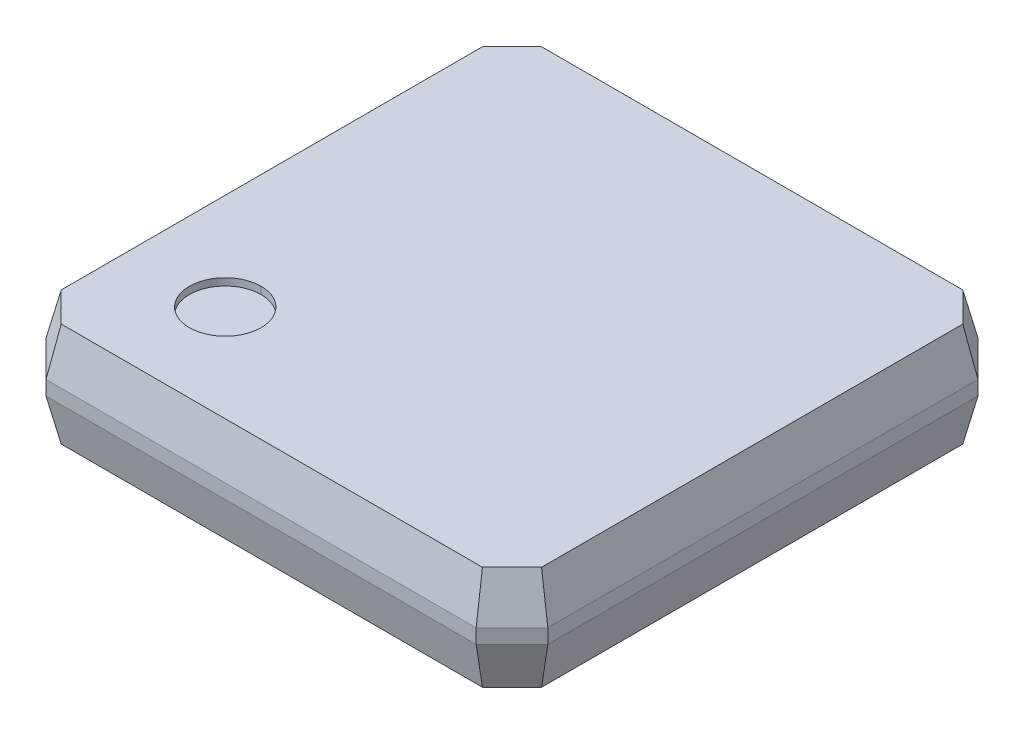
ISO-10303-21;
HEADER;
FILE_DESCRIPTION(('STEP AP214'),'2;1');
FILE_NAME('part.step','',(''),(''),'','','');
FILE_SCHEMA(('AUTOMOTIVE_DESIGN { 1 0 10303 214 1 1 1 1 }'));
ENDSEC;
DATA;
#1=APPLICATION_CONTEXT('core data for automotive mechanical design processes');
#2=APPLICATION_PROTOCOL_DEFINITION('international standard','automotive_design',2000,#1);
#3=PRODUCT_CONTEXT('',#1,'mechanical');
#4=PRODUCT('Part','Part','',(#3));
#5=PRODUCT_RELATED_PRODUCT_CATEGORY('part','',(#4));
#6=PRODUCT_DEFINITION_FORMATION('','',#4);
#7=PRODUCT_DEFINITION_CONTEXT('part definition',#1,'design');
#8=PRODUCT_DEFINITION('design','',#6,#7);
#9=PRODUCT_DEFINITION_SHAPE('','',#8);
#10=(LENGTH_UNIT() NAMED_UNIT(*) SI_UNIT(.MILLI.,.METRE.));
#11=(NAMED_UNIT(*) PLANE_ANGLE_UNIT() SI_UNIT($,.RADIAN.));
#12=(NAMED_UNIT(*) SI_UNIT($,.STERADIAN.) SOLID_ANGLE_UNIT());
#13=UNCERTAINTY_MEASURE_WITH_UNIT(LENGTH_MEASURE(1.E-05),#10,'distance_accuracy_value','');
#14=(GEOMETRIC_REPRESENTATION_CONTEXT(3) GLOBAL_UNCERTAINTY_ASSIGNED_CONTEXT((#13)) GLOBAL_UNIT_ASSIGNED_CONTEXT((#10,
#11,#12)) REPRESENTATION_CONTEXT('',''));
#15=CARTESIAN_POINT('',(0.,0.,0.));
#16=DIRECTION('',(0.,0.,1.));
#17=DIRECTION('',(1.,0.,0.));
#18=AXIS2_PLACEMENT_3D('',#15,#16,#17);
#19=CARTESIAN_POINT('',(-2.,1.6,2.));
#20=DIRECTION('',(0.,-1.,0.));
#21=DIRECTION('',(0.,0.,-1.));
#22=AXIS2_PLACEMENT_3D('',#19,#20,#21);
#23=CYLINDRICAL_SURFACE('',#22,0.5);
#24=CARTESIAN_POINT('',(-2.,1.6,2.));
#25=DIRECTION('',(0.,-1.,0.));
#26=DIRECTION('',(0.,0.,-1.));
#27=AXIS2_PLACEMENT_3D('',#24,#25,#26);
#28=CIRCLE('',#27,0.5);
#29=CARTESIAN_POINT('',(-2.,1.6,2.5));
#30=VERTEX_POINT('',#29);
#31=CARTESIAN_POINT('',(-2.,1.6,1.5));
#32=VERTEX_POINT('',#31);
#33=EDGE_CURVE('E11',#30,#32,#28,.T.);
#34=ORIENTED_EDGE('',*,*,#33,.F.);
#35=DIRECTION('',(0.,-1.,0.));
#36=VECTOR('',#35,1.);
#37=CARTESIAN_POINT('',(-2.,1.6,2.5));
#38=LINE('',#37,#36);
#39=CARTESIAN_POINT('',(-2.,1.5,2.5));
#40=VERTEX_POINT('',#39);
#41=EDGE_CURVE('E23',#30,#40,#38,.T.);
#42=ORIENTED_EDGE('',*,*,#41,.T.);
#43=CARTESIAN_POINT('',(-2.,1.5,2.));
#44=DIRECTION('',(0.,1.,0.));
#45=DIRECTION('',(0.,0.,-1.));
#46=AXIS2_PLACEMENT_3D('',#43,#44,#45);
#47=CIRCLE('',#46,0.5);
#48=CARTESIAN_POINT('',(-2.,1.5,1.5));
#49=VERTEX_POINT('',#48);
#50=EDGE_CURVE('E301',#49,#40,#47,.T.);
#51=ORIENTED_EDGE('',*,*,#50,.F.);
#52=DIRECTION('',(0.,-1.,0.));
#53=VECTOR('',#52,1.);
#54=CARTESIAN_POINT('',(-2.,1.6,1.5));
#55=LINE('',#54,#53);
#56=EDGE_CURVE('E36',#32,#49,#55,.T.);
#57=ORIENTED_EDGE('',*,*,#56,.F.);
#58=EDGE_LOOP('',(#34,#42,#51,#57));
#59=FACE_BOUND('',#58,.T.);
#60=ADVANCED_FACE('F16',(#59),#23,.F.);
#61=CARTESIAN_POINT('',(0.,0.15,-3.5));
#62=DIRECTION('',(0.,-1.,0.));
#63=DIRECTION('',(1.,0.,0.));
#64=AXIS2_PLACEMENT_3D('',#61,#62,#63);
#65=PLANE('',#64);
#66=DIRECTION('',(0.707106781186548,0.,0.707106781186548));
#67=VECTOR('',#66,1.);
#68=CARTESIAN_POINT('',(2.93786796564404,0.15,-3.35));
#69=LINE('',#68,#67);
#70=CARTESIAN_POINT('',(2.93786796564404,0.15,-3.35));
#71=VERTEX_POINT('',#70);
#72=CARTESIAN_POINT('',(3.35,0.15,-2.93786796564404));
#73=VERTEX_POINT('',#72);
#74=EDGE_CURVE('E298',#71,#73,#69,.T.);
#75=ORIENTED_EDGE('',*,*,#74,.T.);
#76=DIRECTION('',(0.,0.,1.));
#77=VECTOR('',#76,1.);
#78=CARTESIAN_POINT('',(3.35,0.15,-3.5));
#79=LINE('',#78,#77);
#80=CARTESIAN_POINT('',(3.35,0.149999999999999,2.93786796564403));
#81=VERTEX_POINT('',#80);
#82=EDGE_CURVE('E296',#73,#81,#79,.T.);
#83=ORIENTED_EDGE('',*,*,#82,.T.);
#84=DIRECTION('',(-0.707106781186548,0.,0.707106781186548));
#85=VECTOR('',#84,1.);
#86=CARTESIAN_POINT('',(3.35,0.15,2.93786796564403));
#87=LINE('',#86,#85);
#88=CARTESIAN_POINT('',(2.93786796564403,0.149999999999999,3.35));
#89=VERTEX_POINT('',#88);
#90=EDGE_CURVE('E294',#81,#89,#87,.T.);
#91=ORIENTED_EDGE('',*,*,#90,.T.);
#92=DIRECTION('',(-1.,0.,0.));
#93=VECTOR('',#92,1.);
#94=CARTESIAN_POINT('',(0.,0.15,3.35));
#95=LINE('',#94,#93);
#96=CARTESIAN_POINT('',(-2.93786796564403,0.149999999999999,3.35));
#97=VERTEX_POINT('',#96);
#98=EDGE_CURVE('E292',#89,#97,#95,.T.);
#99=ORIENTED_EDGE('',*,*,#98,.T.);
#100=DIRECTION('',(-0.707106781186548,0.,-0.707106781186548));
#101=VECTOR('',#100,1.);
#102=CARTESIAN_POINT('',(-2.93786796564403,0.15,3.35));
#103=LINE('',#102,#101);
#104=CARTESIAN_POINT('',(-3.35,0.149999999999999,2.93786796564403));
#105=VERTEX_POINT('',#104);
#106=EDGE_CURVE('E290',#97,#105,#103,.T.);
#107=ORIENTED_EDGE('',*,*,#106,.T.);
#108=DIRECTION('',(0.,0.,-1.));
#109=VECTOR('',#108,1.);
#110=CARTESIAN_POINT('',(-3.35,0.15,-3.5));
#111=LINE('',#110,#109);
#112=CARTESIAN_POINT('',(-3.35,0.15,-2.93786796564404));
#113=VERTEX_POINT('',#112);
#114=EDGE_CURVE('E288',#105,#113,#111,.T.);
#115=ORIENTED_EDGE('',*,*,#114,.T.);
#116=DIRECTION('',(0.707106781186548,0.,-0.707106781186548));
#117=VECTOR('',#116,1.);
#118=CARTESIAN_POINT('',(-3.35,0.15,-2.93786796564404));
#119=LINE('',#118,#117);
#120=CARTESIAN_POINT('',(-2.93786796564404,0.15,-3.35));
#121=VERTEX_POINT('',#120);
#122=EDGE_CURVE('E286',#113,#121,#119,.T.);
#123=ORIENTED_EDGE('',*,*,#122,.T.);
#124=DIRECTION('',(1.,0.,0.));
#125=VECTOR('',#124,1.);
#126=CARTESIAN_POINT('',(0.,0.15,-3.35));
#127=LINE('',#126,#125);
#128=EDGE_CURVE('E283',#121,#71,#127,.T.);
#129=ORIENTED_EDGE('',*,*,#128,.T.);
#130=EDGE_LOOP('',(#75,#83,#91,#99,#107,#115,#123,#129));
#131=FACE_BOUND('',#130,.T.);
#132=ADVANCED_FACE('F314',(#131),#65,.T.);
#133=CARTESIAN_POINT('',(3.425,0.4625,-3.5));
#134=DIRECTION('',(0.972387301980518,-0.233372952475323,0.));
#135=DIRECTION('',(0.233372952475323,0.972387301980518,0.));
#136=AXIS2_PLACEMENT_3D('',#133,#134,#135);
#137=PLANE('',#136);
#138=DIRECTION('',(0.232290174282965,0.967875726179025,-0.0962177405940082));
#139=VECTOR('',#138,1.);
#140=CARTESIAN_POINT('',(3.35,0.15,-2.93786796564404));
#141=LINE('',#140,#139);
#142=CARTESIAN_POINT('',(3.5,0.775,-3.));
#143=VERTEX_POINT('',#142);
#144=EDGE_CURVE('E281',#73,#143,#141,.T.);
#145=ORIENTED_EDGE('',*,*,#144,.T.);
#146=DIRECTION('',(0.,0.,1.));
#147=VECTOR('',#146,1.);
#148=CARTESIAN_POINT('',(3.5,0.775,-3.5));
#149=LINE('',#148,#147);
#150=CARTESIAN_POINT('',(3.5,0.775,3.));
#151=VERTEX_POINT('',#150);
#152=EDGE_CURVE('E279',#143,#151,#149,.T.);
#153=ORIENTED_EDGE('',*,*,#152,.T.);
#154=DIRECTION('',(-0.232290174282964,-0.967875726179023,-0.0962177405940229));
#155=VECTOR('',#154,1.);
#156=CARTESIAN_POINT('',(3.5,0.775,3.));
#157=LINE('',#156,#155);
#158=EDGE_CURVE('E276',#151,#81,#157,.T.);
#159=ORIENTED_EDGE('',*,*,#158,.T.);
#160=ORIENTED_EDGE('',*,*,#82,.F.);
#161=EDGE_LOOP('',(#145,#153,#159,#160));
#162=FACE_BOUND('',#161,.T.);
#163=ADVANCED_FACE('F318',(#162),#137,.T.);
#164=CARTESIAN_POINT('',(2.32196699141101,0.4625,-4.07196699141101));
#165=DIRECTION('',(0.687581655170116,-0.233372952475322,-0.687581655170115));
#166=DIRECTION('',(-0.707106781186547,0.,-0.707106781186548));
#167=AXIS2_PLACEMENT_3D('',#164,#165,#166);
#168=PLANE('',#167);
#169=ORIENTED_EDGE('',*,*,#144,.F.);
#170=ORIENTED_EDGE('',*,*,#74,.F.);
#171=DIRECTION('',(0.09621774059401,0.967875726179024,-0.232290174282967));
#172=VECTOR('',#171,1.);
#173=CARTESIAN_POINT('',(2.93786796564404,0.15,-3.35));
#174=LINE('',#173,#172);
#175=CARTESIAN_POINT('',(3.,0.775,-3.5));
#176=VERTEX_POINT('',#175);
#177=EDGE_CURVE('E274',#71,#176,#174,.T.);
#178=ORIENTED_EDGE('',*,*,#177,.T.);
#179=DIRECTION('',(0.707106781186547,0.,0.707106781186548));
#180=VECTOR('',#179,1.);
#181=CARTESIAN_POINT('',(2.375,0.775000000000001,-4.125));
#182=LINE('',#181,#180);
#183=EDGE_CURVE('E271',#176,#143,#182,.T.);
#184=ORIENTED_EDGE('',*,*,#183,.T.);
#185=EDGE_LOOP('',(#169,#170,#178,#184));
#186=FACE_BOUND('',#185,.T.);
#187=ADVANCED_FACE('F323',(#186),#168,.T.);
#188=CARTESIAN_POINT('',(0.,0.4625,-3.425));
#189=DIRECTION('',(0.,-0.233372952475325,-0.972387301980517));
#190=DIRECTION('',(0.,0.972387301980517,-0.233372952475325));
#191=AXIS2_PLACEMENT_3D('',#188,#189,#190);
#192=PLANE('',#191);
#193=ORIENTED_EDGE('',*,*,#177,.F.);
#194=ORIENTED_EDGE('',*,*,#128,.F.);
#195=DIRECTION('',(-0.0962177405940082,0.967875726179024,-0.232290174282967));
#196=VECTOR('',#195,1.);
#197=CARTESIAN_POINT('',(-2.93786796564404,0.15,-3.35));
#198=LINE('',#197,#196);
#199=CARTESIAN_POINT('',(-3.,0.775,-3.5));
#200=VERTEX_POINT('',#199);
#201=EDGE_CURVE('E269',#121,#200,#198,.T.);
#202=ORIENTED_EDGE('',*,*,#201,.T.);
#203=DIRECTION('',(1.,0.,0.));
#204=VECTOR('',#203,1.);
#205=CARTESIAN_POINT('',(0.,0.775,-3.5));
#206=LINE('',#205,#204);
#207=EDGE_CURVE('E266',#200,#176,#206,.T.);
#208=ORIENTED_EDGE('',*,*,#207,.T.);
#209=EDGE_LOOP('',(#193,#194,#202,#208));
#210=FACE_BOUND('',#209,.T.);
#211=ADVANCED_FACE('F329',(#210),#192,.T.);
#212=CARTESIAN_POINT('',(-2.32196699141101,0.4625,-4.07196699141101));
#213=DIRECTION('',(-0.687581655170116,-0.233372952475322,-0.687581655170115));
#214=DIRECTION('',(-0.707106781186547,0.,0.707106781186548));
#215=AXIS2_PLACEMENT_3D('',#212,#213,#214);
#216=PLANE('',#215);
#217=ORIENTED_EDGE('',*,*,#201,.F.);
#218=ORIENTED_EDGE('',*,*,#122,.F.);
#219=DIRECTION('',(-0.232290174282967,0.967875726179024,-0.0962177405940095));
#220=VECTOR('',#219,1.);
#221=CARTESIAN_POINT('',(-3.35,0.15,-2.93786796564404));
#222=LINE('',#221,#220);
#223=CARTESIAN_POINT('',(-3.5,0.775,-3.));
#224=VERTEX_POINT('',#223);
#225=EDGE_CURVE('E264',#113,#224,#222,.T.);
#226=ORIENTED_EDGE('',*,*,#225,.T.);
#227=DIRECTION('',(0.707106781186547,0.,-0.707106781186548));
#228=VECTOR('',#227,1.);
#229=CARTESIAN_POINT('',(-2.375,0.775,-4.125));
#230=LINE('',#229,#228);
#231=EDGE_CURVE('E261',#224,#200,#230,.T.);
#232=ORIENTED_EDGE('',*,*,#231,.T.);
#233=EDGE_LOOP('',(#217,#218,#226,#232));
#234=FACE_BOUND('',#233,.T.);
#235=ADVANCED_FACE('F333',(#234),#216,.T.);
#236=CARTESIAN_POINT('',(-3.425,0.4625,-3.5));
#237=DIRECTION('',(-0.972387301980518,-0.233372952475323,0.));
#238=DIRECTION('',(0.233372952475323,-0.972387301980518,0.));
#239=AXIS2_PLACEMENT_3D('',#236,#237,#238);
#240=PLANE('',#239);
#241=ORIENTED_EDGE('',*,*,#225,.F.);
#242=ORIENTED_EDGE('',*,*,#114,.F.);
#243=DIRECTION('',(-0.232290174282964,0.967875726179023,0.0962177405940229));
#244=VECTOR('',#243,1.);
#245=CARTESIAN_POINT('',(-3.35,0.15,2.93786796564403));
#246=LINE('',#245,#244);
#247=CARTESIAN_POINT('',(-3.5,0.775,3.));
#248=VERTEX_POINT('',#247);
#249=EDGE_CURVE('E259',#105,#248,#246,.T.);
#250=ORIENTED_EDGE('',*,*,#249,.T.);
#251=DIRECTION('',(0.,0.,-1.));
#252=VECTOR('',#251,1.);
#253=CARTESIAN_POINT('',(-3.5,0.775,-3.5));
#254=LINE('',#253,#252);
#255=EDGE_CURVE('E256',#248,#224,#254,.T.);
#256=ORIENTED_EDGE('',*,*,#255,.T.);
#257=EDGE_LOOP('',(#241,#242,#250,#256));
#258=FACE_BOUND('',#257,.T.);
#259=ADVANCED_FACE('F337',(#258),#240,.T.);
#260=CARTESIAN_POINT('',(-4.07196699141101,0.462499999999999,2.32196699141101));
#261=DIRECTION('',(-0.687581655170115,-0.233372952475325,0.687581655170115));
#262=DIRECTION('',(0.707106781186548,0.,0.707106781186548));
#263=AXIS2_PLACEMENT_3D('',#260,#261,#262);
#264=PLANE('',#263);
#265=ORIENTED_EDGE('',*,*,#249,.F.);
#266=ORIENTED_EDGE('',*,*,#106,.F.);
#267=DIRECTION('',(-0.0962177405940195,0.967875726179025,0.23229017428296));
#268=VECTOR('',#267,1.);
#269=CARTESIAN_POINT('',(-2.93786796564403,0.149999999999999,3.35));
#270=LINE('',#269,#268);
#271=CARTESIAN_POINT('',(-3.,0.775,3.5));
#272=VERTEX_POINT('',#271);
#273=EDGE_CURVE('E254',#97,#272,#270,.T.);
#274=ORIENTED_EDGE('',*,*,#273,.T.);
#275=DIRECTION('',(-0.707106781186548,0.,-0.707106781186548));
#276=VECTOR('',#275,1.);
#277=CARTESIAN_POINT('',(-4.125,0.774999999999999,2.375));
#278=LINE('',#277,#276);
#279=EDGE_CURVE('E251',#272,#248,#278,.T.);
#280=ORIENTED_EDGE('',*,*,#279,.T.);
#281=EDGE_LOOP('',(#265,#266,#274,#280));
#282=FACE_BOUND('',#281,.T.);
#283=ADVANCED_FACE('F341',(#282),#264,.T.);
#284=CARTESIAN_POINT('',(0.,0.4625,3.425));
#285=DIRECTION('',(0.,-0.233372952475324,0.972387301980518));
#286=DIRECTION('',(0.,-0.972387301980518,-0.233372952475324));
#287=AXIS2_PLACEMENT_3D('',#284,#285,#286);
#288=PLANE('',#287);
#289=ORIENTED_EDGE('',*,*,#273,.F.);
#290=ORIENTED_EDGE('',*,*,#98,.F.);
#291=DIRECTION('',(0.0962177405940233,0.967875726179023,0.232290174282965));
#292=VECTOR('',#291,1.);
#293=CARTESIAN_POINT('',(2.93786796564403,0.15,3.35));
#294=LINE('',#293,#292);
#295=CARTESIAN_POINT('',(3.,0.775,3.5));
#296=VERTEX_POINT('',#295);
#297=EDGE_CURVE('E249',#89,#296,#294,.T.);
#298=ORIENTED_EDGE('',*,*,#297,.T.);
#299=DIRECTION('',(-1.,0.,0.));
#300=VECTOR('',#299,1.);
#301=CARTESIAN_POINT('',(0.,0.775000000000001,3.5));
#302=LINE('',#301,#300);
#303=EDGE_CURVE('E246',#296,#272,#302,.T.);
#304=ORIENTED_EDGE('',*,*,#303,.T.);
#305=EDGE_LOOP('',(#289,#290,#298,#304));
#306=FACE_BOUND('',#305,.T.);
#307=ADVANCED_FACE('F345',(#306),#288,.T.);
#308=CARTESIAN_POINT('',(4.07196699141101,0.4625,2.32196699141101));
#309=DIRECTION('',(0.687581655170115,-0.233372952475325,0.687581655170115));
#310=DIRECTION('',(0.707106781186548,0.,-0.707106781186548));
#311=AXIS2_PLACEMENT_3D('',#308,#309,#310);
#312=PLANE('',#311);
#313=ORIENTED_EDGE('',*,*,#297,.F.);
#314=ORIENTED_EDGE('',*,*,#90,.F.);
#315=ORIENTED_EDGE('',*,*,#158,.F.);
#316=DIRECTION('',(-0.707106781186548,0.,0.707106781186548));
#317=VECTOR('',#316,1.);
#318=CARTESIAN_POINT('',(4.125,0.774999999999999,2.375));
#319=LINE('',#318,#317);
#320=EDGE_CURVE('E243',#151,#296,#319,.T.);
#321=ORIENTED_EDGE('',*,*,#320,.T.);
#322=EDGE_LOOP('',(#313,#314,#315,#321));
#323=FACE_BOUND('',#322,.T.);
#324=ADVANCED_FACE('F349',(#323),#312,.T.);
#325=CARTESIAN_POINT('',(3.5,0.875,-3.5));
#326=DIRECTION('',(1.,0.,0.));
#327=DIRECTION('',(0.,0.,-1.));
#328=AXIS2_PLACEMENT_3D('',#325,#326,#327);
#329=PLANE('',#328);
#330=DIRECTION('',(0.,1.,0.));
#331=VECTOR('',#330,1.);
#332=CARTESIAN_POINT('',(3.5,0.875,-3.));
#333=LINE('',#332,#331);
#334=CARTESIAN_POINT('',(3.5,0.974999999999999,-3.));
#335=VERTEX_POINT('',#334);
#336=EDGE_CURVE('E241',#143,#335,#333,.T.);
#337=ORIENTED_EDGE('',*,*,#336,.T.);
#338=DIRECTION('',(0.,0.,1.));
#339=VECTOR('',#338,1.);
#340=CARTESIAN_POINT('',(3.5,0.974999999999999,-3.5));
#341=LINE('',#340,#339);
#342=CARTESIAN_POINT('',(3.5,0.974999999999999,3.));
#343=VERTEX_POINT('',#342);
#344=EDGE_CURVE('E239',#335,#343,#341,.T.);
#345=ORIENTED_EDGE('',*,*,#344,.T.);
#346=DIRECTION('',(0.,-1.,0.));
#347=VECTOR('',#346,1.);
#348=CARTESIAN_POINT('',(3.5,0.875,3.));
#349=LINE('',#348,#347);
#350=EDGE_CURVE('E236',#343,#151,#349,.T.);
#351=ORIENTED_EDGE('',*,*,#350,.T.);
#352=ORIENTED_EDGE('',*,*,#152,.F.);
#353=EDGE_LOOP('',(#337,#345,#351,#352));
#354=FACE_BOUND('',#353,.T.);
#355=ADVANCED_FACE('F353',(#354),#329,.T.);
#356=CARTESIAN_POINT('',(3.25,0.875,-3.25));
#357=DIRECTION('',(0.707106781186548,0.,-0.707106781186547));
#358=DIRECTION('',(-0.707106781186547,0.,-0.707106781186548));
#359=AXIS2_PLACEMENT_3D('',#356,#357,#358);
#360=PLANE('',#359);
#361=DIRECTION('',(0.707106781186547,0.,0.707106781186548));
#362=VECTOR('',#361,1.);
#363=CARTESIAN_POINT('',(3.25,0.974999999999999,-3.25));
#364=LINE('',#363,#362);
#365=CARTESIAN_POINT('',(3.,0.974999999999999,-3.5));
#366=VERTEX_POINT('',#365);
#367=EDGE_CURVE('E233',#366,#335,#364,.T.);
#368=ORIENTED_EDGE('',*,*,#367,.T.);
#369=ORIENTED_EDGE('',*,*,#336,.F.);
#370=ORIENTED_EDGE('',*,*,#183,.F.);
#371=DIRECTION('',(0.,1.,0.));
#372=VECTOR('',#371,1.);
#373=CARTESIAN_POINT('',(3.,0.875,-3.5));
#374=LINE('',#373,#372);
#375=EDGE_CURVE('E230',#176,#366,#374,.T.);
#376=ORIENTED_EDGE('',*,*,#375,.T.);
#377=EDGE_LOOP('',(#368,#369,#370,#376));
#378=FACE_BOUND('',#377,.T.);
#379=ADVANCED_FACE('F357',(#378),#360,.T.);
#380=CARTESIAN_POINT('',(0.,0.875,-3.5));
#381=DIRECTION('',(0.,0.,1.));
#382=DIRECTION('',(0.,-1.,0.));
#383=AXIS2_PLACEMENT_3D('',#380,#381,#382);
#384=PLANE('',#383);
#385=DIRECTION('',(-1.,0.,0.));
#386=VECTOR('',#385,1.);
#387=CARTESIAN_POINT('',(0.,0.974999999999999,-3.5));
#388=LINE('',#387,#386);
#389=CARTESIAN_POINT('',(-3.,0.974999999999999,-3.5));
#390=VERTEX_POINT('',#389);
#391=EDGE_CURVE('E228',#366,#390,#388,.T.);
#392=ORIENTED_EDGE('',*,*,#391,.F.);
#393=ORIENTED_EDGE('',*,*,#375,.F.);
#394=ORIENTED_EDGE('',*,*,#207,.F.);
#395=DIRECTION('',(0.,-1.,0.));
#396=VECTOR('',#395,1.);
#397=CARTESIAN_POINT('',(-3.,0.875,-3.5));
#398=LINE('',#397,#396);
#399=EDGE_CURVE('E225',#390,#200,#398,.T.);
#400=ORIENTED_EDGE('',*,*,#399,.F.);
#401=EDGE_LOOP('',(#392,#393,#394,#400));
#402=FACE_BOUND('',#401,.T.);
#403=ADVANCED_FACE('F361',(#402),#384,.F.);
#404=CARTESIAN_POINT('',(-3.25,0.875,-3.25));
#405=DIRECTION('',(-0.707106781186548,0.,-0.707106781186547));
#406=DIRECTION('',(-0.707106781186547,0.,0.707106781186548));
#407=AXIS2_PLACEMENT_3D('',#404,#405,#406);
#408=PLANE('',#407);
#409=DIRECTION('',(0.707106781186547,0.,-0.707106781186548));
#410=VECTOR('',#409,1.);
#411=CARTESIAN_POINT('',(-3.25,0.974999999999999,-3.25));
#412=LINE('',#411,#410);
#413=CARTESIAN_POINT('',(-3.5,0.974999999999999,-3.));
#414=VERTEX_POINT('',#413);
#415=EDGE_CURVE('E222',#414,#390,#412,.T.);
#416=ORIENTED_EDGE('',*,*,#415,.T.);
#417=ORIENTED_EDGE('',*,*,#399,.T.);
#418=ORIENTED_EDGE('',*,*,#231,.F.);
#419=DIRECTION('',(0.,1.,0.));
#420=VECTOR('',#419,1.);
#421=CARTESIAN_POINT('',(-3.5,0.875,-3.));
#422=LINE('',#421,#420);
#423=EDGE_CURVE('E219',#224,#414,#422,.T.);
#424=ORIENTED_EDGE('',*,*,#423,.T.);
#425=EDGE_LOOP('',(#416,#417,#418,#424));
#426=FACE_BOUND('',#425,.T.);
#427=ADVANCED_FACE('F365',(#426),#408,.T.);
#428=CARTESIAN_POINT('',(-3.5,0.875,-3.5));
#429=DIRECTION('',(-1.,0.,0.));
#430=DIRECTION('',(0.,0.,1.));
#431=AXIS2_PLACEMENT_3D('',#428,#429,#430);
#432=PLANE('',#431);
#433=ORIENTED_EDGE('',*,*,#423,.F.);
#434=ORIENTED_EDGE('',*,*,#255,.F.);
#435=DIRECTION('',(0.,1.,0.));
#436=VECTOR('',#435,1.);
#437=CARTESIAN_POINT('',(-3.5,0.875,3.));
#438=LINE('',#437,#436);
#439=CARTESIAN_POINT('',(-3.5,0.974999999999999,3.));
#440=VERTEX_POINT('',#439);
#441=EDGE_CURVE('E217',#248,#440,#438,.T.);
#442=ORIENTED_EDGE('',*,*,#441,.T.);
#443=DIRECTION('',(0.,0.,-1.));
#444=VECTOR('',#443,1.);
#445=CARTESIAN_POINT('',(-3.5,0.974999999999999,-3.5));
#446=LINE('',#445,#444);
#447=EDGE_CURVE('E214',#440,#414,#446,.T.);
#448=ORIENTED_EDGE('',*,*,#447,.T.);
#449=EDGE_LOOP('',(#433,#434,#442,#448));
#450=FACE_BOUND('',#449,.T.);
#451=ADVANCED_FACE('F369',(#450),#432,.T.);
#452=CARTESIAN_POINT('',(-3.25,0.875,3.25));
#453=DIRECTION('',(-0.707106781186548,0.,0.707106781186548));
#454=DIRECTION('',(0.707106781186548,0.,0.707106781186548));
#455=AXIS2_PLACEMENT_3D('',#452,#453,#454);
#456=PLANE('',#455);
#457=DIRECTION('',(-0.707106781186548,0.,-0.707106781186548));
#458=VECTOR('',#457,1.);
#459=CARTESIAN_POINT('',(-3.25,0.974999999999999,3.25));
#460=LINE('',#459,#458);
#461=CARTESIAN_POINT('',(-3.,0.974999999999999,3.5));
#462=VERTEX_POINT('',#461);
#463=EDGE_CURVE('E211',#462,#440,#460,.T.);
#464=ORIENTED_EDGE('',*,*,#463,.T.);
#465=ORIENTED_EDGE('',*,*,#441,.F.);
#466=ORIENTED_EDGE('',*,*,#279,.F.);
#467=DIRECTION('',(0.,1.,0.));
#468=VECTOR('',#467,1.);
#469=CARTESIAN_POINT('',(-3.,0.875,3.5));
#470=LINE('',#469,#468);
#471=EDGE_CURVE('E208',#272,#462,#470,.T.);
#472=ORIENTED_EDGE('',*,*,#471,.T.);
#473=EDGE_LOOP('',(#464,#465,#466,#472));
#474=FACE_BOUND('',#473,.T.);
#475=ADVANCED_FACE('F373',(#474),#456,.T.);
#476=CARTESIAN_POINT('',(0.,0.875,3.5));
#477=DIRECTION('',(0.,0.,1.));
#478=DIRECTION('',(0.,-1.,0.));
#479=AXIS2_PLACEMENT_3D('',#476,#477,#478);
#480=PLANE('',#479);
#481=ORIENTED_EDGE('',*,*,#471,.F.);
#482=ORIENTED_EDGE('',*,*,#303,.F.);
#483=DIRECTION('',(0.,1.,0.));
#484=VECTOR('',#483,1.);
#485=CARTESIAN_POINT('',(3.,0.875,3.5));
#486=LINE('',#485,#484);
#487=CARTESIAN_POINT('',(3.,0.974999999999999,3.5));
#488=VERTEX_POINT('',#487);
#489=EDGE_CURVE('E206',#296,#488,#486,.T.);
#490=ORIENTED_EDGE('',*,*,#489,.T.);
#491=DIRECTION('',(-1.,0.,0.));
#492=VECTOR('',#491,1.);
#493=CARTESIAN_POINT('',(0.,0.974999999999999,3.5));
#494=LINE('',#493,#492);
#495=EDGE_CURVE('E147',#488,#462,#494,.T.);
#496=ORIENTED_EDGE('',*,*,#495,.T.);
#497=EDGE_LOOP('',(#481,#482,#490,#496));
#498=FACE_BOUND('',#497,.T.);
#499=ADVANCED_FACE('F377',(#498),#480,.T.);
#500=CARTESIAN_POINT('',(3.25,0.875,3.25));
#501=DIRECTION('',(0.707106781186548,0.,0.707106781186548));
#502=DIRECTION('',(0.707106781186548,0.,-0.707106781186548));
#503=AXIS2_PLACEMENT_3D('',#500,#501,#502);
#504=PLANE('',#503);
#505=DIRECTION('',(-0.707106781186548,0.,0.707106781186548));
#506=VECTOR('',#505,1.);
#507=CARTESIAN_POINT('',(3.25,0.974999999999999,3.25));
#508=LINE('',#507,#506);
#509=EDGE_CURVE('E203',#343,#488,#508,.T.);
#510=ORIENTED_EDGE('',*,*,#509,.T.);
#511=ORIENTED_EDGE('',*,*,#489,.F.);
#512=ORIENTED_EDGE('',*,*,#320,.F.);
#513=ORIENTED_EDGE('',*,*,#350,.F.);
#514=EDGE_LOOP('',(#510,#511,#512,#513));
#515=FACE_BOUND('',#514,.T.);
#516=ADVANCED_FACE('F381',(#515),#504,.T.);
#517=CARTESIAN_POINT('',(3.425,1.2875,-3.5));
#518=DIRECTION('',(0.972387301980518,0.233372952475323,0.));
#519=DIRECTION('',(-0.233372952475323,0.972387301980518,0.));
#520=AXIS2_PLACEMENT_3D('',#517,#518,#519);
#521=PLANE('',#520);
#522=DIRECTION('',(-0.232290174282965,0.967875726179025,0.096217740594008));
#523=VECTOR('',#522,1.);
#524=CARTESIAN_POINT('',(3.5,0.974999999999999,-3.));
#525=LINE('',#524,#523);
#526=CARTESIAN_POINT('',(3.35,1.6,-2.93786796564404));
#527=VERTEX_POINT('',#526);
#528=EDGE_CURVE('E201',#335,#527,#525,.T.);
#529=ORIENTED_EDGE('',*,*,#528,.T.);
#530=DIRECTION('',(0.,0.,1.));
#531=VECTOR('',#530,1.);
#532=CARTESIAN_POINT('',(3.35,1.6,-3.5));
#533=LINE('',#532,#531);
#534=CARTESIAN_POINT('',(3.35,1.6,2.93786796564403));
#535=VERTEX_POINT('',#534);
#536=EDGE_CURVE('E199',#527,#535,#533,.T.);
#537=ORIENTED_EDGE('',*,*,#536,.T.);
#538=DIRECTION('',(0.232290174282964,-0.967875726179023,0.0962177405940227));
#539=VECTOR('',#538,1.);
#540=CARTESIAN_POINT('',(3.35,1.6,2.93786796564403));
#541=LINE('',#540,#539);
#542=EDGE_CURVE('E167',#535,#343,#541,.T.);
#543=ORIENTED_EDGE('',*,*,#542,.T.);
#544=ORIENTED_EDGE('',*,*,#344,.F.);
#545=EDGE_LOOP('',(#529,#537,#543,#544));
#546=FACE_BOUND('',#545,.T.);
#547=ADVANCED_FACE('F385',(#546),#521,.T.);
#548=CARTESIAN_POINT('',(2.32196699141101,1.2875,-4.07196699141101));
#549=DIRECTION('',(0.687581655170116,0.233372952475322,-0.687581655170115));
#550=DIRECTION('',(-0.707106781186547,0.,-0.707106781186548));
#551=AXIS2_PLACEMENT_3D('',#548,#549,#550);
#552=PLANE('',#551);
#553=DIRECTION('',(-0.09621774059401,0.967875726179024,0.232290174282967));
#554=VECTOR('',#553,1.);
#555=CARTESIAN_POINT('',(3.,0.974999999999999,-3.5));
#556=LINE('',#555,#554);
#557=CARTESIAN_POINT('',(2.93786796564404,1.6,-3.35));
#558=VERTEX_POINT('',#557);
#559=EDGE_CURVE('E196',#366,#558,#556,.T.);
#560=ORIENTED_EDGE('',*,*,#559,.T.);
#561=DIRECTION('',(0.707106781186547,0.,0.707106781186548));
#562=VECTOR('',#561,1.);
#563=CARTESIAN_POINT('',(2.26893398282202,1.6,-4.01893398282202));
#564=LINE('',#563,#562);
#565=EDGE_CURVE('E193',#558,#527,#564,.T.);
#566=ORIENTED_EDGE('',*,*,#565,.T.);
#567=ORIENTED_EDGE('',*,*,#528,.F.);
#568=ORIENTED_EDGE('',*,*,#367,.F.);
#569=EDGE_LOOP('',(#560,#566,#567,#568));
#570=FACE_BOUND('',#569,.T.);
#571=ADVANCED_FACE('F389',(#570),#552,.T.);
#572=CARTESIAN_POINT('',(0.,1.2875,-3.425));
#573=DIRECTION('',(0.,0.233372952475325,-0.972387301980517));
#574=DIRECTION('',(0.,0.972387301980517,0.233372952475325));
#575=AXIS2_PLACEMENT_3D('',#572,#573,#574);
#576=PLANE('',#575);
#577=ORIENTED_EDGE('',*,*,#559,.F.);
#578=ORIENTED_EDGE('',*,*,#391,.T.);
#579=DIRECTION('',(0.096217740594008,0.967875726179024,0.232290174282967));
#580=VECTOR('',#579,1.);
#581=CARTESIAN_POINT('',(-3.,0.974999999999999,-3.5));
#582=LINE('',#581,#580);
#583=CARTESIAN_POINT('',(-2.93786796564404,1.6,-3.35));
#584=VERTEX_POINT('',#583);
#585=EDGE_CURVE('E191',#390,#584,#582,.T.);
#586=ORIENTED_EDGE('',*,*,#585,.T.);
#587=DIRECTION('',(1.,0.,0.));
#588=VECTOR('',#587,1.);
#589=CARTESIAN_POINT('',(0.,1.6,-3.35));
#590=LINE('',#589,#588);
#591=EDGE_CURVE('E188',#584,#558,#590,.T.);
#592=ORIENTED_EDGE('',*,*,#591,.T.);
#593=EDGE_LOOP('',(#577,#578,#586,#592));
#594=FACE_BOUND('',#593,.T.);
#595=ADVANCED_FACE('F393',(#594),#576,.T.);
#596=CARTESIAN_POINT('',(-2.32196699141101,1.2875,-4.07196699141101));
#597=DIRECTION('',(-0.687581655170116,0.233372952475322,-0.687581655170115));
#598=DIRECTION('',(-0.707106781186547,0.,0.707106781186548));
#599=AXIS2_PLACEMENT_3D('',#596,#597,#598);
#600=PLANE('',#599);
#601=DIRECTION('',(0.232290174282967,0.967875726179024,0.09621774059401));
#602=VECTOR('',#601,1.);
#603=CARTESIAN_POINT('',(-3.5,0.974999999999999,-3.));
#604=LINE('',#603,#602);
#605=CARTESIAN_POINT('',(-3.35,1.6,-2.93786796564404));
#606=VERTEX_POINT('',#605);
#607=EDGE_CURVE('E186',#414,#606,#604,.T.);
#608=ORIENTED_EDGE('',*,*,#607,.T.);
#609=DIRECTION('',(0.707106781186547,0.,-0.707106781186548));
#610=VECTOR('',#609,1.);
#611=CARTESIAN_POINT('',(-2.26893398282202,1.6,-4.01893398282202));
#612=LINE('',#611,#610);
#613=EDGE_CURVE('E183',#606,#584,#612,.T.);
#614=ORIENTED_EDGE('',*,*,#613,.T.);
#615=ORIENTED_EDGE('',*,*,#585,.F.);
#616=ORIENTED_EDGE('',*,*,#415,.F.);
#617=EDGE_LOOP('',(#608,#614,#615,#616));
#618=FACE_BOUND('',#617,.T.);
#619=ADVANCED_FACE('F397',(#618),#600,.T.);
#620=CARTESIAN_POINT('',(-3.425,1.2875,-3.5));
#621=DIRECTION('',(-0.972387301980518,0.233372952475323,0.));
#622=DIRECTION('',(-0.233372952475323,-0.972387301980518,0.));
#623=AXIS2_PLACEMENT_3D('',#620,#621,#622);
#624=PLANE('',#623);
#625=ORIENTED_EDGE('',*,*,#607,.F.);
#626=ORIENTED_EDGE('',*,*,#447,.F.);
#627=DIRECTION('',(0.232290174282964,0.967875726179023,-0.0962177405940227));
#628=VECTOR('',#627,1.);
#629=CARTESIAN_POINT('',(-3.5,0.974999999999999,3.));
#630=LINE('',#629,#628);
#631=CARTESIAN_POINT('',(-3.35,1.6,2.93786796564403));
#632=VERTEX_POINT('',#631);
#633=EDGE_CURVE('E181',#440,#632,#630,.T.);
#634=ORIENTED_EDGE('',*,*,#633,.T.);
#635=DIRECTION('',(0.,0.,-1.));
#636=VECTOR('',#635,1.);
#637=CARTESIAN_POINT('',(-3.35,1.6,-3.5));
#638=LINE('',#637,#636);
#639=EDGE_CURVE('E178',#632,#606,#638,.T.);
#640=ORIENTED_EDGE('',*,*,#639,.T.);
#641=EDGE_LOOP('',(#625,#626,#634,#640));
#642=FACE_BOUND('',#641,.T.);
#643=ADVANCED_FACE('F401',(#642),#624,.T.);
#644=CARTESIAN_POINT('',(-4.07196699141101,1.2875,2.32196699141101));
#645=DIRECTION('',(-0.687581655170115,0.233372952475325,0.687581655170115));
#646=DIRECTION('',(0.707106781186548,0.,0.707106781186548));
#647=AXIS2_PLACEMENT_3D('',#644,#645,#646);
#648=PLANE('',#647);
#649=DIRECTION('',(0.0962177405940199,0.967875726179024,-0.23229017428296));
#650=VECTOR('',#649,1.);
#651=CARTESIAN_POINT('',(-3.,0.974999999999999,3.5));
#652=LINE('',#651,#650);
#653=CARTESIAN_POINT('',(-2.93786796564403,1.6,3.35));
#654=VERTEX_POINT('',#653);
#655=EDGE_CURVE('E176',#462,#654,#652,.T.);
#656=ORIENTED_EDGE('',*,*,#655,.T.);
#657=DIRECTION('',(-0.707106781186548,0.,-0.707106781186548));
#658=VECTOR('',#657,1.);
#659=CARTESIAN_POINT('',(-4.01893398282202,1.6,2.26893398282202));
#660=LINE('',#659,#658);
#661=EDGE_CURVE('E152',#654,#632,#660,.T.);
#662=ORIENTED_EDGE('',*,*,#661,.T.);
#663=ORIENTED_EDGE('',*,*,#633,.F.);
#664=ORIENTED_EDGE('',*,*,#463,.F.);
#665=EDGE_LOOP('',(#656,#662,#663,#664));
#666=FACE_BOUND('',#665,.T.);
#667=ADVANCED_FACE('F405',(#666),#648,.T.);
#668=CARTESIAN_POINT('',(0.,1.2875,3.425));
#669=DIRECTION('',(0.,0.233372952475324,0.972387301980518));
#670=DIRECTION('',(0.,-0.972387301980518,0.233372952475324));
#671=AXIS2_PLACEMENT_3D('',#668,#669,#670);
#672=PLANE('',#671);
#673=ORIENTED_EDGE('',*,*,#655,.F.);
#674=ORIENTED_EDGE('',*,*,#495,.F.);
#675=DIRECTION('',(-0.0962177405940233,0.967875726179023,-0.232290174282965));
#676=VECTOR('',#675,1.);
#677=CARTESIAN_POINT('',(3.,0.974999999999999,3.5));
#678=LINE('',#677,#676);
#679=CARTESIAN_POINT('',(2.93786796564403,1.6,3.35));
#680=VERTEX_POINT('',#679);
#681=EDGE_CURVE('E141',#488,#680,#678,.T.);
#682=ORIENTED_EDGE('',*,*,#681,.T.);
#683=DIRECTION('',(-1.,0.,0.));
#684=VECTOR('',#683,1.);
#685=CARTESIAN_POINT('',(0.,1.6,3.35));
#686=LINE('',#685,#684);
#687=EDGE_CURVE('E145',#680,#654,#686,.T.);
#688=ORIENTED_EDGE('',*,*,#687,.T.);
#689=EDGE_LOOP('',(#673,#674,#682,#688));
#690=FACE_BOUND('',#689,.T.);
#691=ADVANCED_FACE('F144',(#690),#672,.T.);
#692=CARTESIAN_POINT('',(4.07196699141101,1.2875,2.32196699141101));
#693=DIRECTION('',(0.687581655170115,0.233372952475325,0.687581655170115));
#694=DIRECTION('',(0.707106781186548,0.,-0.707106781186548));
#695=AXIS2_PLACEMENT_3D('',#692,#693,#694);
#696=PLANE('',#695);
#697=ORIENTED_EDGE('',*,*,#542,.F.);
#698=DIRECTION('',(-0.707106781186548,0.,0.707106781186548));
#699=VECTOR('',#698,1.);
#700=CARTESIAN_POINT('',(4.01893398282202,1.6,2.26893398282202));
#701=LINE('',#700,#699);
#702=EDGE_CURVE('E160',#535,#680,#701,.T.);
#703=ORIENTED_EDGE('',*,*,#702,.T.);
#704=ORIENTED_EDGE('',*,*,#681,.F.);
#705=ORIENTED_EDGE('',*,*,#509,.F.);
#706=EDGE_LOOP('',(#697,#703,#704,#705));
#707=FACE_BOUND('',#706,.T.);
#708=ADVANCED_FACE('F165',(#707),#696,.T.);
#709=CARTESIAN_POINT('',(0.,1.6,-3.5));
#710=DIRECTION('',(0.,1.,0.));
#711=DIRECTION('',(0.,0.,1.));
#712=AXIS2_PLACEMENT_3D('',#709,#710,#711);
#713=PLANE('',#712);
#714=ORIENTED_EDGE('',*,*,#661,.F.);
#715=ORIENTED_EDGE('',*,*,#687,.F.);
#716=ORIENTED_EDGE('',*,*,#702,.F.);
#717=ORIENTED_EDGE('',*,*,#536,.F.);
#718=ORIENTED_EDGE('',*,*,#565,.F.);
#719=ORIENTED_EDGE('',*,*,#591,.F.);
#720=ORIENTED_EDGE('',*,*,#613,.F.);
#721=ORIENTED_EDGE('',*,*,#639,.F.);
#722=EDGE_LOOP('',(#714,#715,#716,#717,#718,#719,#720,#721));
#723=FACE_BOUND('',#722,.T.);
#724=CARTESIAN_POINT('',(-2.,1.6,2.));
#725=DIRECTION('',(0.,-1.,0.));
#726=DIRECTION('',(0.,0.,-1.));
#727=AXIS2_PLACEMENT_3D('',#724,#725,#726);
#728=CIRCLE('',#727,0.5);
#729=EDGE_CURVE('E168',#32,#30,#728,.T.);
#730=ORIENTED_EDGE('',*,*,#729,.T.);
#731=ORIENTED_EDGE('',*,*,#33,.T.);
#732=EDGE_LOOP('',(#730,#731));
#733=FACE_BOUND('',#732,.T.);
#734=ADVANCED_FACE('F157',(#723,#733),#713,.T.);
#735=CARTESIAN_POINT('',(-2.,1.6,2.));
#736=DIRECTION('',(0.,-1.,0.));
#737=DIRECTION('',(0.,0.,-1.));
#738=AXIS2_PLACEMENT_3D('',#735,#736,#737);
#739=CYLINDRICAL_SURFACE('',#738,0.5);
#740=ORIENTED_EDGE('',*,*,#41,.F.);
#741=ORIENTED_EDGE('',*,*,#729,.F.);
#742=ORIENTED_EDGE('',*,*,#56,.T.);
#743=CARTESIAN_POINT('',(-2.,1.5,2.));
#744=DIRECTION('',(0.,1.,0.));
#745=DIRECTION('',(0.,0.,-1.));
#746=AXIS2_PLACEMENT_3D('',#743,#744,#745);
#747=CIRCLE('',#746,0.5);
#748=EDGE_CURVE('E171',#40,#49,#747,.T.);
#749=ORIENTED_EDGE('',*,*,#748,.F.);
#750=EDGE_LOOP('',(#740,#741,#742,#749));
#751=FACE_BOUND('',#750,.T.);
#752=ADVANCED_FACE('F303',(#751),#739,.F.);
#753=CARTESIAN_POINT('',(-2.,1.5,2.));
#754=DIRECTION('',(0.,1.,0.));
#755=DIRECTION('',(0.,0.,1.));
#756=AXIS2_PLACEMENT_3D('',#753,#754,#755);
#757=PLANE('',#756);
#758=ORIENTED_EDGE('',*,*,#50,.T.);
#759=ORIENTED_EDGE('',*,*,#748,.T.);
#760=EDGE_LOOP('',(#758,#759));
#761=FACE_BOUND('',#760,.T.);
#762=ADVANCED_FACE('F305',(#761),#757,.T.);
#763=CLOSED_SHELL('',(#60,#132,#163,#187,#211,#235,#259,#283,#307,#324,#355,#379,#403,#427,#451,
#475,#499,#516,#547,#571,#595,#619,#643,#667,#691,#708,#734,#752,#762));
#764=MANIFOLD_SOLID_BREP('B1',#763);
#765=ADVANCED_BREP_SHAPE_REPRESENTATION('',(#18,#764),#14);
#766=SHAPE_DEFINITION_REPRESENTATION(#9,#765);
ENDSEC;
END-ISO-10303-21;
